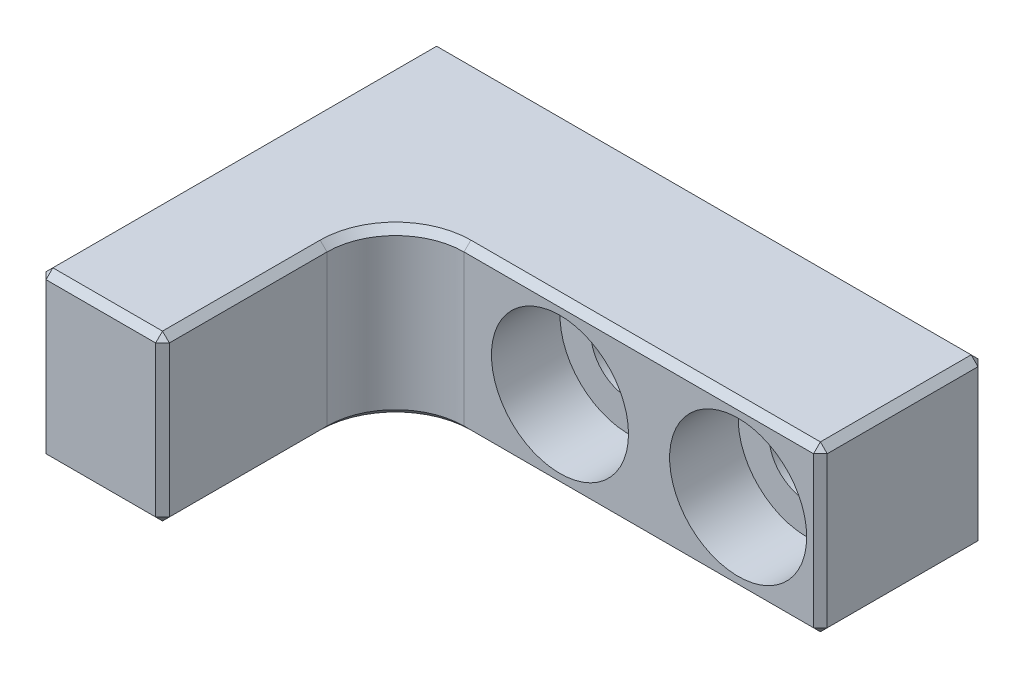
ISO-10303-21;
HEADER;
FILE_DESCRIPTION(('STEP AP214'),'2;1');
FILE_NAME('part.step','',(''),(''),'','','');
FILE_SCHEMA(('AUTOMOTIVE_DESIGN { 1 0 10303 214 1 1 1 1 }'));
ENDSEC;
DATA;
#1=APPLICATION_CONTEXT('core data for automotive mechanical design processes');
#2=APPLICATION_PROTOCOL_DEFINITION('international standard','automotive_design',2000,#1);
#3=PRODUCT_CONTEXT('',#1,'mechanical');
#4=PRODUCT('Part','Part','',(#3));
#5=PRODUCT_RELATED_PRODUCT_CATEGORY('part','',(#4));
#6=PRODUCT_DEFINITION_FORMATION('','',#4);
#7=PRODUCT_DEFINITION_CONTEXT('part definition',#1,'design');
#8=PRODUCT_DEFINITION('design','',#6,#7);
#9=PRODUCT_DEFINITION_SHAPE('','',#8);
#10=(LENGTH_UNIT() NAMED_UNIT(*) SI_UNIT(.MILLI.,.METRE.));
#11=(NAMED_UNIT(*) PLANE_ANGLE_UNIT() SI_UNIT($,.RADIAN.));
#12=(NAMED_UNIT(*) SI_UNIT($,.STERADIAN.) SOLID_ANGLE_UNIT());
#13=UNCERTAINTY_MEASURE_WITH_UNIT(LENGTH_MEASURE(1.E-05),#10,'distance_accuracy_value','');
#14=(GEOMETRIC_REPRESENTATION_CONTEXT(3) GLOBAL_UNCERTAINTY_ASSIGNED_CONTEXT((#13)) GLOBAL_UNIT_ASSIGNED_CONTEXT((#10,
#11,#12)) REPRESENTATION_CONTEXT('',''));
#15=CARTESIAN_POINT('',(0.,0.,0.));
#16=DIRECTION('',(0.,0.,1.));
#17=DIRECTION('',(1.,0.,0.));
#18=AXIS2_PLACEMENT_3D('',#15,#16,#17);
#19=CARTESIAN_POINT('',(0.,12.,12.));
#20=DIRECTION('',(0.,0.,-1.));
#21=DIRECTION('',(-1.,0.,0.));
#22=AXIS2_PLACEMENT_3D('',#19,#20,#21);
#23=PLANE('',#22);
#24=CARTESIAN_POINT('',(34.,6.,12.));
#25=DIRECTION('',(0.,0.,1.));
#26=DIRECTION('',(1.,0.,0.));
#27=AXIS2_PLACEMENT_3D('',#24,#25,#26);
#28=CIRCLE('',#27,5.);
#29=CARTESIAN_POINT('',(39.,6.,12.));
#30=VERTEX_POINT('',#29);
#31=EDGE_CURVE('E360',#30,#30,#28,.T.);
#32=ORIENTED_EDGE('',*,*,#31,.F.);
#33=EDGE_LOOP('',(#32));
#34=FACE_BOUND('',#33,.T.);
#35=CARTESIAN_POINT('',(21.,6.,12.));
#36=DIRECTION('',(0.,0.,1.));
#37=DIRECTION('',(1.,0.,0.));
#38=AXIS2_PLACEMENT_3D('',#35,#36,#37);
#39=CIRCLE('',#38,5.);
#40=CARTESIAN_POINT('',(26.,6.,12.));
#41=VERTEX_POINT('',#40);
#42=EDGE_CURVE('E379',#41,#41,#39,.T.);
#43=ORIENTED_EDGE('',*,*,#42,.F.);
#44=EDGE_LOOP('',(#43));
#45=FACE_BOUND('',#44,.T.);
#46=DIRECTION('',(0.,1.,0.));
#47=VECTOR('',#46,1.);
#48=CARTESIAN_POINT('',(39.5,12.,12.));
#49=LINE('',#48,#47);
#50=CARTESIAN_POINT('',(39.5,0.5,12.));
#51=VERTEX_POINT('',#50);
#52=CARTESIAN_POINT('',(39.5,11.5,12.));
#53=VERTEX_POINT('',#52);
#54=EDGE_CURVE('E226',#51,#53,#49,.T.);
#55=ORIENTED_EDGE('',*,*,#54,.T.);
#56=DIRECTION('',(-1.,0.,0.));
#57=VECTOR('',#56,1.);
#58=CARTESIAN_POINT('',(0.,11.5,12.));
#59=LINE('',#58,#57);
#60=CARTESIAN_POINT('',(14.,11.5,12.));
#61=VERTEX_POINT('',#60);
#62=EDGE_CURVE('E228',#53,#61,#59,.T.);
#63=ORIENTED_EDGE('',*,*,#62,.T.);
#64=DIRECTION('',(0.,1.,0.));
#65=VECTOR('',#64,1.);
#66=CARTESIAN_POINT('',(14.,0.,12.));
#67=LINE('',#66,#65);
#68=CARTESIAN_POINT('',(14.,0.5,12.));
#69=VERTEX_POINT('',#68);
#70=EDGE_CURVE('E201',#61,#69,#67,.F.);
#71=ORIENTED_EDGE('',*,*,#70,.T.);
#72=DIRECTION('',(1.,0.,0.));
#73=VECTOR('',#72,1.);
#74=CARTESIAN_POINT('',(0.,0.5,12.));
#75=LINE('',#74,#73);
#76=EDGE_CURVE('E224',#69,#51,#75,.T.);
#77=ORIENTED_EDGE('',*,*,#76,.T.);
#78=EDGE_LOOP('',(#55,#63,#71,#77));
#79=FACE_BOUND('',#78,.T.);
#80=ADVANCED_FACE('F34',(#34,#45,#79),#23,.F.);
#81=CARTESIAN_POINT('',(0.,0.,12.));
#82=DIRECTION('',(1.,0.,0.));
#83=DIRECTION('',(0.,0.,-1.));
#84=AXIS2_PLACEMENT_3D('',#81,#82,#83);
#85=PLANE('',#84);
#86=DIRECTION('',(0.,0.,1.));
#87=VECTOR('',#86,1.);
#88=CARTESIAN_POINT('',(0.,0.5,12.));
#89=LINE('',#88,#87);
#90=CARTESIAN_POINT('',(0.,0.5,0.5));
#91=VERTEX_POINT('',#90);
#92=CARTESIAN_POINT('',(0.,0.5,28.5));
#93=VERTEX_POINT('',#92);
#94=EDGE_CURVE('E219',#91,#93,#89,.T.);
#95=ORIENTED_EDGE('',*,*,#94,.T.);
#96=DIRECTION('',(0.,1.,0.));
#97=VECTOR('',#96,1.);
#98=CARTESIAN_POINT('',(0.,12.,28.5));
#99=LINE('',#98,#97);
#100=CARTESIAN_POINT('',(0.,11.5,28.5));
#101=VERTEX_POINT('',#100);
#102=EDGE_CURVE('E183',#93,#101,#99,.T.);
#103=ORIENTED_EDGE('',*,*,#102,.T.);
#104=DIRECTION('',(0.,0.,-1.));
#105=VECTOR('',#104,1.);
#106=CARTESIAN_POINT('',(0.,11.5,12.));
#107=LINE('',#106,#105);
#108=CARTESIAN_POINT('',(0.,11.5,0.5));
#109=VERTEX_POINT('',#108);
#110=EDGE_CURVE('E221',#101,#109,#107,.T.);
#111=ORIENTED_EDGE('',*,*,#110,.T.);
#112=DIRECTION('',(0.,-1.,0.));
#113=VECTOR('',#112,1.);
#114=CARTESIAN_POINT('',(0.,0.,0.5));
#115=LINE('',#114,#113);
#116=EDGE_CURVE('E217',#109,#91,#115,.T.);
#117=ORIENTED_EDGE('',*,*,#116,.T.);
#118=EDGE_LOOP('',(#95,#103,#111,#117));
#119=FACE_BOUND('',#118,.T.);
#120=ADVANCED_FACE('F429',(#119),#85,.F.);
#121=CARTESIAN_POINT('',(0.,0.,12.));
#122=DIRECTION('',(0.,1.,0.));
#123=DIRECTION('',(0.,0.,1.));
#124=AXIS2_PLACEMENT_3D('',#121,#122,#123);
#125=PLANE('',#124);
#126=DIRECTION('',(-1.,0.,0.));
#127=VECTOR('',#126,1.);
#128=CARTESIAN_POINT('',(0.,0.,28.5));
#129=LINE('',#128,#127);
#130=CARTESIAN_POINT('',(8.5,0.,28.5));
#131=VERTEX_POINT('',#130);
#132=CARTESIAN_POINT('',(0.5,0.,28.5));
#133=VERTEX_POINT('',#132);
#134=EDGE_CURVE('E43',#131,#133,#129,.T.);
#135=ORIENTED_EDGE('',*,*,#134,.T.);
#136=DIRECTION('',(0.,0.,-1.));
#137=VECTOR('',#136,1.);
#138=CARTESIAN_POINT('',(0.5,0.,12.));
#139=LINE('',#138,#137);
#140=CARTESIAN_POINT('',(0.5,0.,0.5));
#141=VERTEX_POINT('',#140);
#142=EDGE_CURVE('E11',#133,#141,#139,.T.);
#143=ORIENTED_EDGE('',*,*,#142,.T.);
#144=DIRECTION('',(1.,0.,0.));
#145=VECTOR('',#144,1.);
#146=CARTESIAN_POINT('',(40.,0.,0.5));
#147=LINE('',#146,#145);
#148=CARTESIAN_POINT('',(39.5,0.,0.5));
#149=VERTEX_POINT('',#148);
#150=EDGE_CURVE('E267',#141,#149,#147,.T.);
#151=ORIENTED_EDGE('',*,*,#150,.T.);
#152=DIRECTION('',(0.,0.,1.));
#153=VECTOR('',#152,1.);
#154=CARTESIAN_POINT('',(39.5,0.,12.));
#155=LINE('',#154,#153);
#156=CARTESIAN_POINT('',(39.5,0.,11.5));
#157=VERTEX_POINT('',#156);
#158=EDGE_CURVE('E269',#149,#157,#155,.T.);
#159=ORIENTED_EDGE('',*,*,#158,.T.);
#160=DIRECTION('',(-1.,0.,0.));
#161=VECTOR('',#160,1.);
#162=CARTESIAN_POINT('',(0.,0.,11.5));
#163=LINE('',#162,#161);
#164=CARTESIAN_POINT('',(14.,0.,11.5));
#165=VERTEX_POINT('',#164);
#166=EDGE_CURVE('E271',#157,#165,#163,.T.);
#167=ORIENTED_EDGE('',*,*,#166,.T.);
#168=CARTESIAN_POINT('',(14.,0.,17.));
#169=DIRECTION('',(0.,1.,0.));
#170=DIRECTION('',(0.,0.,1.));
#171=AXIS2_PLACEMENT_3D('',#168,#169,#170);
#172=CIRCLE('',#171,5.5);
#173=CARTESIAN_POINT('',(8.5,0.,17.));
#174=VERTEX_POINT('',#173);
#175=EDGE_CURVE('E273',#165,#174,#172,.T.);
#176=ORIENTED_EDGE('',*,*,#175,.T.);
#177=DIRECTION('',(0.,0.,1.));
#178=VECTOR('',#177,1.);
#179=CARTESIAN_POINT('',(8.5,0.,12.));
#180=LINE('',#179,#178);
#181=EDGE_CURVE('E54',#174,#131,#180,.T.);
#182=ORIENTED_EDGE('',*,*,#181,.T.);
#183=EDGE_LOOP('',(#135,#143,#151,#159,#167,#176,#182));
#184=FACE_BOUND('',#183,.T.);
#185=ADVANCED_FACE('F435',(#184),#125,.F.);
#186=CARTESIAN_POINT('',(40.,0.,12.));
#187=DIRECTION('',(-1.,0.,0.));
#188=DIRECTION('',(0.,0.,1.));
#189=AXIS2_PLACEMENT_3D('',#186,#187,#188);
#190=PLANE('',#189);
#191=DIRECTION('',(0.,1.,0.));
#192=VECTOR('',#191,1.);
#193=CARTESIAN_POINT('',(40.,12.,0.5));
#194=LINE('',#193,#192);
#195=CARTESIAN_POINT('',(40.,0.5,0.5));
#196=VERTEX_POINT('',#195);
#197=CARTESIAN_POINT('',(40.,11.5,0.5));
#198=VERTEX_POINT('',#197);
#199=EDGE_CURVE('E232',#196,#198,#194,.T.);
#200=ORIENTED_EDGE('',*,*,#199,.T.);
#201=DIRECTION('',(0.,0.,1.));
#202=VECTOR('',#201,1.);
#203=CARTESIAN_POINT('',(40.,11.5,12.));
#204=LINE('',#203,#202);
#205=CARTESIAN_POINT('',(40.,11.5,11.5));
#206=VERTEX_POINT('',#205);
#207=EDGE_CURVE('E237',#198,#206,#204,.T.);
#208=ORIENTED_EDGE('',*,*,#207,.T.);
#209=DIRECTION('',(0.,-1.,0.));
#210=VECTOR('',#209,1.);
#211=CARTESIAN_POINT('',(40.,0.,11.5));
#212=LINE('',#211,#210);
#213=CARTESIAN_POINT('',(40.,0.5,11.5));
#214=VERTEX_POINT('',#213);
#215=EDGE_CURVE('E234',#206,#214,#212,.T.);
#216=ORIENTED_EDGE('',*,*,#215,.T.);
#217=DIRECTION('',(0.,0.,-1.));
#218=VECTOR('',#217,1.);
#219=CARTESIAN_POINT('',(40.,0.5,12.));
#220=LINE('',#219,#218);
#221=EDGE_CURVE('E230',#214,#196,#220,.T.);
#222=ORIENTED_EDGE('',*,*,#221,.T.);
#223=EDGE_LOOP('',(#200,#208,#216,#222));
#224=FACE_BOUND('',#223,.T.);
#225=ADVANCED_FACE('F490',(#224),#190,.F.);
#226=CARTESIAN_POINT('',(0.,12.,12.));
#227=DIRECTION('',(0.,-1.,0.));
#228=DIRECTION('',(0.,0.,-1.));
#229=AXIS2_PLACEMENT_3D('',#226,#227,#228);
#230=PLANE('',#229);
#231=DIRECTION('',(1.,0.,0.));
#232=VECTOR('',#231,1.);
#233=CARTESIAN_POINT('',(0.,12.,11.5));
#234=LINE('',#233,#232);
#235=CARTESIAN_POINT('',(14.,12.,11.5));
#236=VERTEX_POINT('',#235);
#237=CARTESIAN_POINT('',(39.5,12.,11.5));
#238=VERTEX_POINT('',#237);
#239=EDGE_CURVE('E258',#236,#238,#234,.T.);
#240=ORIENTED_EDGE('',*,*,#239,.T.);
#241=DIRECTION('',(0.,0.,-1.));
#242=VECTOR('',#241,1.);
#243=CARTESIAN_POINT('',(39.5,12.,12.));
#244=LINE('',#243,#242);
#245=CARTESIAN_POINT('',(39.5,12.,0.5));
#246=VERTEX_POINT('',#245);
#247=EDGE_CURVE('E260',#238,#246,#244,.T.);
#248=ORIENTED_EDGE('',*,*,#247,.T.);
#249=DIRECTION('',(-1.,0.,0.));
#250=VECTOR('',#249,1.);
#251=CARTESIAN_POINT('',(0.,12.,0.5));
#252=LINE('',#251,#250);
#253=CARTESIAN_POINT('',(0.5,12.,0.5));
#254=VERTEX_POINT('',#253);
#255=EDGE_CURVE('E248',#246,#254,#252,.T.);
#256=ORIENTED_EDGE('',*,*,#255,.T.);
#257=DIRECTION('',(0.,0.,1.));
#258=VECTOR('',#257,1.);
#259=CARTESIAN_POINT('',(0.5,12.,12.));
#260=LINE('',#259,#258);
#261=CARTESIAN_POINT('',(0.5,12.,28.5));
#262=VERTEX_POINT('',#261);
#263=EDGE_CURVE('E250',#254,#262,#260,.T.);
#264=ORIENTED_EDGE('',*,*,#263,.T.);
#265=DIRECTION('',(1.,0.,0.));
#266=VECTOR('',#265,1.);
#267=CARTESIAN_POINT('',(9.,12.,28.5));
#268=LINE('',#267,#266);
#269=CARTESIAN_POINT('',(8.5,12.,28.5));
#270=VERTEX_POINT('',#269);
#271=EDGE_CURVE('E252',#262,#270,#268,.T.);
#272=ORIENTED_EDGE('',*,*,#271,.T.);
#273=DIRECTION('',(0.,0.,-1.));
#274=VECTOR('',#273,1.);
#275=CARTESIAN_POINT('',(8.5,12.,12.));
#276=LINE('',#275,#274);
#277=CARTESIAN_POINT('',(8.5,12.,17.));
#278=VERTEX_POINT('',#277);
#279=EDGE_CURVE('E254',#270,#278,#276,.T.);
#280=ORIENTED_EDGE('',*,*,#279,.T.);
#281=CARTESIAN_POINT('',(14.,12.,17.));
#282=DIRECTION('',(0.,-1.,0.));
#283=DIRECTION('',(0.,0.,-1.));
#284=AXIS2_PLACEMENT_3D('',#281,#282,#283);
#285=CIRCLE('',#284,5.5);
#286=EDGE_CURVE('E256',#278,#236,#285,.T.);
#287=ORIENTED_EDGE('',*,*,#286,.T.);
#288=EDGE_LOOP('',(#240,#248,#256,#264,#272,#280,#287));
#289=FACE_BOUND('',#288,.T.);
#290=ADVANCED_FACE('F486',(#289),#230,.F.);
#291=CARTESIAN_POINT('',(0.,12.,0.));
#292=DIRECTION('',(0.,0.,-1.));
#293=DIRECTION('',(-1.,0.,0.));
#294=AXIS2_PLACEMENT_3D('',#291,#292,#293);
#295=PLANE('',#294);
#296=DIRECTION('',(1.,0.,0.));
#297=VECTOR('',#296,1.);
#298=CARTESIAN_POINT('',(40.,11.5,0.));
#299=LINE('',#298,#297);
#300=CARTESIAN_POINT('',(0.5,11.5,0.));
#301=VERTEX_POINT('',#300);
#302=CARTESIAN_POINT('',(39.5,11.5,0.));
#303=VERTEX_POINT('',#302);
#304=EDGE_CURVE('E243',#301,#303,#299,.T.);
#305=ORIENTED_EDGE('',*,*,#304,.T.);
#306=DIRECTION('',(0.,-1.,0.));
#307=VECTOR('',#306,1.);
#308=CARTESIAN_POINT('',(39.5,0.,0.));
#309=LINE('',#308,#307);
#310=CARTESIAN_POINT('',(39.5,0.5,0.));
#311=VERTEX_POINT('',#310);
#312=EDGE_CURVE('E245',#303,#311,#309,.T.);
#313=ORIENTED_EDGE('',*,*,#312,.T.);
#314=DIRECTION('',(-1.,0.,0.));
#315=VECTOR('',#314,1.);
#316=CARTESIAN_POINT('',(0.,0.5,0.));
#317=LINE('',#316,#315);
#318=CARTESIAN_POINT('',(0.5,0.5,0.));
#319=VERTEX_POINT('',#318);
#320=EDGE_CURVE('E241',#311,#319,#317,.T.);
#321=ORIENTED_EDGE('',*,*,#320,.T.);
#322=DIRECTION('',(0.,1.,0.));
#323=VECTOR('',#322,1.);
#324=CARTESIAN_POINT('',(0.5,12.,0.));
#325=LINE('',#324,#323);
#326=EDGE_CURVE('E239',#319,#301,#325,.T.);
#327=ORIENTED_EDGE('',*,*,#326,.T.);
#328=EDGE_LOOP('',(#305,#313,#321,#327));
#329=FACE_BOUND('',#328,.T.);
#330=CARTESIAN_POINT('',(34.,6.,0.));
#331=DIRECTION('',(0.,0.,1.));
#332=DIRECTION('',(1.,0.,0.));
#333=AXIS2_PLACEMENT_3D('',#330,#331,#332);
#334=CIRCLE('',#333,2.75);
#335=CARTESIAN_POINT('',(36.75,6.,0.));
#336=VERTEX_POINT('',#335);
#337=EDGE_CURVE('E376',#336,#336,#334,.T.);
#338=ORIENTED_EDGE('',*,*,#337,.T.);
#339=EDGE_LOOP('',(#338));
#340=FACE_BOUND('',#339,.T.);
#341=CARTESIAN_POINT('',(21.,6.,0.));
#342=DIRECTION('',(0.,0.,1.));
#343=DIRECTION('',(1.,0.,0.));
#344=AXIS2_PLACEMENT_3D('',#341,#342,#343);
#345=CIRCLE('',#344,2.75);
#346=CARTESIAN_POINT('',(23.75,6.,0.));
#347=VERTEX_POINT('',#346);
#348=EDGE_CURVE('E388',#347,#347,#345,.T.);
#349=ORIENTED_EDGE('',*,*,#348,.T.);
#350=EDGE_LOOP('',(#349));
#351=FACE_BOUND('',#350,.T.);
#352=ADVANCED_FACE('F483',(#329,#340,#351),#295,.T.);
#353=CARTESIAN_POINT('',(9.,12.,29.));
#354=DIRECTION('',(-1.,0.,0.));
#355=DIRECTION('',(0.,-1.,0.));
#356=AXIS2_PLACEMENT_3D('',#353,#354,#355);
#357=PLANE('',#356);
#358=DIRECTION('',(0.,1.,0.));
#359=VECTOR('',#358,1.);
#360=CARTESIAN_POINT('',(9.,12.,17.));
#361=LINE('',#360,#359);
#362=CARTESIAN_POINT('',(9.,0.5,17.));
#363=VERTEX_POINT('',#362);
#364=CARTESIAN_POINT('',(9.,11.5,17.));
#365=VERTEX_POINT('',#364);
#366=EDGE_CURVE('E204',#363,#365,#361,.T.);
#367=ORIENTED_EDGE('',*,*,#366,.T.);
#368=DIRECTION('',(0.,0.,1.));
#369=VECTOR('',#368,1.);
#370=CARTESIAN_POINT('',(9.,11.5,29.));
#371=LINE('',#370,#369);
#372=CARTESIAN_POINT('',(9.,11.5,28.5));
#373=VERTEX_POINT('',#372);
#374=EDGE_CURVE('E215',#365,#373,#371,.T.);
#375=ORIENTED_EDGE('',*,*,#374,.T.);
#376=DIRECTION('',(0.,-1.,0.));
#377=VECTOR('',#376,1.);
#378=CARTESIAN_POINT('',(9.,0.,28.5));
#379=LINE('',#378,#377);
#380=CARTESIAN_POINT('',(9.,0.5,28.5));
#381=VERTEX_POINT('',#380);
#382=EDGE_CURVE('E212',#373,#381,#379,.T.);
#383=ORIENTED_EDGE('',*,*,#382,.T.);
#384=DIRECTION('',(0.,0.,-1.));
#385=VECTOR('',#384,1.);
#386=CARTESIAN_POINT('',(9.,0.5,29.));
#387=LINE('',#386,#385);
#388=EDGE_CURVE('E210',#381,#363,#387,.T.);
#389=ORIENTED_EDGE('',*,*,#388,.T.);
#390=EDGE_LOOP('',(#367,#375,#383,#389));
#391=FACE_BOUND('',#390,.T.);
#392=ADVANCED_FACE('F394',(#391),#357,.F.);
#393=CARTESIAN_POINT('',(0.,0.,29.));
#394=DIRECTION('',(0.,0.,1.));
#395=DIRECTION('',(1.,0.,0.));
#396=AXIS2_PLACEMENT_3D('',#393,#394,#395);
#397=PLANE('',#396);
#398=DIRECTION('',(0.,1.,0.));
#399=VECTOR('',#398,1.);
#400=CARTESIAN_POINT('',(8.5,12.,29.));
#401=LINE('',#400,#399);
#402=CARTESIAN_POINT('',(8.5,0.5,29.));
#403=VERTEX_POINT('',#402);
#404=CARTESIAN_POINT('',(8.5,11.5,29.));
#405=VERTEX_POINT('',#404);
#406=EDGE_CURVE('E175',#403,#405,#401,.T.);
#407=ORIENTED_EDGE('',*,*,#406,.T.);
#408=DIRECTION('',(-1.,0.,0.));
#409=VECTOR('',#408,1.);
#410=CARTESIAN_POINT('',(0.,11.5,29.));
#411=LINE('',#410,#409);
#412=CARTESIAN_POINT('',(0.5,11.5,29.));
#413=VERTEX_POINT('',#412);
#414=EDGE_CURVE('E171',#405,#413,#411,.T.);
#415=ORIENTED_EDGE('',*,*,#414,.T.);
#416=DIRECTION('',(0.,-1.,0.));
#417=VECTOR('',#416,1.);
#418=CARTESIAN_POINT('',(0.5,0.,29.));
#419=LINE('',#418,#417);
#420=CARTESIAN_POINT('',(0.5,0.5,29.));
#421=VERTEX_POINT('',#420);
#422=EDGE_CURVE('E163',#413,#421,#419,.T.);
#423=ORIENTED_EDGE('',*,*,#422,.T.);
#424=DIRECTION('',(1.,0.,0.));
#425=VECTOR('',#424,1.);
#426=CARTESIAN_POINT('',(9.,0.5,29.));
#427=LINE('',#426,#425);
#428=EDGE_CURVE('E168',#421,#403,#427,.T.);
#429=ORIENTED_EDGE('',*,*,#428,.T.);
#430=EDGE_LOOP('',(#407,#415,#423,#429));
#431=FACE_BOUND('',#430,.T.);
#432=ADVANCED_FACE('F166',(#431),#397,.T.);
#433=CARTESIAN_POINT('',(14.,12.,17.));
#434=DIRECTION('',(0.,-1.,0.));
#435=DIRECTION('',(1.,0.,0.));
#436=AXIS2_PLACEMENT_3D('',#433,#434,#435);
#437=CYLINDRICAL_SURFACE('',#436,5.);
#438=ORIENTED_EDGE('',*,*,#70,.F.);
#439=CARTESIAN_POINT('',(14.,11.5,17.));
#440=DIRECTION('',(0.,-1.,0.));
#441=DIRECTION('',(0.,0.,-1.));
#442=AXIS2_PLACEMENT_3D('',#439,#440,#441);
#443=CIRCLE('',#442,5.);
#444=EDGE_CURVE('E265',#61,#365,#443,.F.);
#445=ORIENTED_EDGE('',*,*,#444,.T.);
#446=ORIENTED_EDGE('',*,*,#366,.F.);
#447=CARTESIAN_POINT('',(14.,0.5,17.));
#448=DIRECTION('',(0.,1.,0.));
#449=DIRECTION('',(0.,0.,1.));
#450=AXIS2_PLACEMENT_3D('',#447,#448,#449);
#451=CIRCLE('',#450,5.);
#452=EDGE_CURVE('E263',#363,#69,#451,.F.);
#453=ORIENTED_EDGE('',*,*,#452,.T.);
#454=EDGE_LOOP('',(#438,#445,#446,#453));
#455=FACE_BOUND('',#454,.T.);
#456=ADVANCED_FACE('F497',(#455),#437,.F.);
#457=CARTESIAN_POINT('',(21.,6.,12.));
#458=DIRECTION('',(0.,0.,1.));
#459=DIRECTION('',(1.,0.,0.));
#460=AXIS2_PLACEMENT_3D('',#457,#458,#459);
#461=CYLINDRICAL_SURFACE('',#460,2.75);
#462=ORIENTED_EDGE('',*,*,#348,.F.);
#463=EDGE_LOOP('',(#462));
#464=FACE_BOUND('',#463,.T.);
#465=CARTESIAN_POINT('',(21.,6.,7.));
#466=DIRECTION('',(0.,0.,1.));
#467=DIRECTION('',(1.,0.,0.));
#468=AXIS2_PLACEMENT_3D('',#465,#466,#467);
#469=CIRCLE('',#468,2.75);
#470=CARTESIAN_POINT('',(23.75,6.,7.));
#471=VERTEX_POINT('',#470);
#472=EDGE_CURVE('E385',#471,#471,#469,.T.);
#473=ORIENTED_EDGE('',*,*,#472,.T.);
#474=EDGE_LOOP('',(#473));
#475=FACE_BOUND('',#474,.T.);
#476=ADVANCED_FACE('F500',(#464,#475),#461,.F.);
#477=CARTESIAN_POINT('',(23.75,6.,7.));
#478=DIRECTION('',(0.,0.,-1.));
#479=DIRECTION('',(-1.,0.,0.));
#480=AXIS2_PLACEMENT_3D('',#477,#478,#479);
#481=PLANE('',#480);
#482=ORIENTED_EDGE('',*,*,#472,.F.);
#483=EDGE_LOOP('',(#482));
#484=FACE_BOUND('',#483,.T.);
#485=CARTESIAN_POINT('',(21.,6.,7.));
#486=DIRECTION('',(0.,0.,1.));
#487=DIRECTION('',(1.,0.,0.));
#488=AXIS2_PLACEMENT_3D('',#485,#486,#487);
#489=CIRCLE('',#488,5.);
#490=CARTESIAN_POINT('',(26.,6.,7.));
#491=VERTEX_POINT('',#490);
#492=EDGE_CURVE('E382',#491,#491,#489,.T.);
#493=ORIENTED_EDGE('',*,*,#492,.T.);
#494=EDGE_LOOP('',(#493));
#495=FACE_BOUND('',#494,.T.);
#496=ADVANCED_FACE('F776',(#484,#495),#481,.F.);
#497=CARTESIAN_POINT('',(21.,6.,12.));
#498=DIRECTION('',(0.,0.,1.));
#499=DIRECTION('',(1.,0.,0.));
#500=AXIS2_PLACEMENT_3D('',#497,#498,#499);
#501=CYLINDRICAL_SURFACE('',#500,5.);
#502=ORIENTED_EDGE('',*,*,#492,.F.);
#503=EDGE_LOOP('',(#502));
#504=FACE_BOUND('',#503,.T.);
#505=ORIENTED_EDGE('',*,*,#42,.T.);
#506=EDGE_LOOP('',(#505));
#507=FACE_BOUND('',#506,.T.);
#508=ADVANCED_FACE('F766',(#504,#507),#501,.F.);
#509=CARTESIAN_POINT('',(34.,6.,12.));
#510=DIRECTION('',(0.,0.,1.));
#511=DIRECTION('',(1.,0.,0.));
#512=AXIS2_PLACEMENT_3D('',#509,#510,#511);
#513=CYLINDRICAL_SURFACE('',#512,2.75);
#514=ORIENTED_EDGE('',*,*,#337,.F.);
#515=EDGE_LOOP('',(#514));
#516=FACE_BOUND('',#515,.T.);
#517=CARTESIAN_POINT('',(34.,6.,7.));
#518=DIRECTION('',(0.,0.,1.));
#519=DIRECTION('',(1.,0.,0.));
#520=AXIS2_PLACEMENT_3D('',#517,#518,#519);
#521=CIRCLE('',#520,2.75);
#522=CARTESIAN_POINT('',(36.75,6.,7.));
#523=VERTEX_POINT('',#522);
#524=EDGE_CURVE('E371',#523,#523,#521,.T.);
#525=ORIENTED_EDGE('',*,*,#524,.T.);
#526=EDGE_LOOP('',(#525));
#527=FACE_BOUND('',#526,.T.);
#528=ADVANCED_FACE('F756',(#516,#527),#513,.F.);
#529=CARTESIAN_POINT('',(36.75,6.,7.));
#530=DIRECTION('',(0.,0.,-1.));
#531=DIRECTION('',(-1.,0.,0.));
#532=AXIS2_PLACEMENT_3D('',#529,#530,#531);
#533=PLANE('',#532);
#534=ORIENTED_EDGE('',*,*,#524,.F.);
#535=EDGE_LOOP('',(#534));
#536=FACE_BOUND('',#535,.T.);
#537=CARTESIAN_POINT('',(34.,6.,7.));
#538=DIRECTION('',(0.,0.,1.));
#539=DIRECTION('',(1.,0.,0.));
#540=AXIS2_PLACEMENT_3D('',#537,#538,#539);
#541=CIRCLE('',#540,5.);
#542=CARTESIAN_POINT('',(39.,6.,7.));
#543=VERTEX_POINT('',#542);
#544=EDGE_CURVE('E366',#543,#543,#541,.T.);
#545=ORIENTED_EDGE('',*,*,#544,.T.);
#546=EDGE_LOOP('',(#545));
#547=FACE_BOUND('',#546,.T.);
#548=ADVANCED_FACE('F745',(#536,#547),#533,.F.);
#549=CARTESIAN_POINT('',(34.,6.,12.));
#550=DIRECTION('',(0.,0.,1.));
#551=DIRECTION('',(1.,0.,0.));
#552=AXIS2_PLACEMENT_3D('',#549,#550,#551);
#553=CYLINDRICAL_SURFACE('',#552,5.);
#554=ORIENTED_EDGE('',*,*,#544,.F.);
#555=EDGE_LOOP('',(#554));
#556=FACE_BOUND('',#555,.T.);
#557=ORIENTED_EDGE('',*,*,#31,.T.);
#558=EDGE_LOOP('',(#557));
#559=FACE_BOUND('',#558,.T.);
#560=ADVANCED_FACE('F735',(#556,#559),#553,.F.);
#561=CARTESIAN_POINT('',(40.,0.,0.5));
#562=DIRECTION('',(0.707106781186547,0.,-0.707106781186547));
#563=DIRECTION('',(-0.707106781186548,0.,-0.707106781186548));
#564=AXIS2_PLACEMENT_3D('',#561,#562,#563);
#565=PLANE('',#564);
#566=DIRECTION('',(0.707106781186547,0.,0.707106781186547));
#567=VECTOR('',#566,1.);
#568=CARTESIAN_POINT('',(39.5,0.5,0.));
#569=LINE('',#568,#567);
#570=EDGE_CURVE('E38',#311,#196,#569,.T.);
#571=ORIENTED_EDGE('',*,*,#570,.F.);
#572=ORIENTED_EDGE('',*,*,#312,.F.);
#573=DIRECTION('',(-0.707106781186547,0.,-0.707106781186547));
#574=VECTOR('',#573,1.);
#575=CARTESIAN_POINT('',(40.,11.5,0.5));
#576=LINE('',#575,#574);
#577=EDGE_CURVE('E353',#198,#303,#576,.T.);
#578=ORIENTED_EDGE('',*,*,#577,.F.);
#579=ORIENTED_EDGE('',*,*,#199,.F.);
#580=EDGE_LOOP('',(#571,#572,#578,#579));
#581=FACE_BOUND('',#580,.T.);
#582=ADVANCED_FACE('F36',(#581),#565,.T.);
#583=CARTESIAN_POINT('',(39.5,0.5,0.));
#584=DIRECTION('',(0.577350269189626,-0.577350269189626,-0.577350269189626));
#585=DIRECTION('',(-0.707106781186547,0.,-0.707106781186547));
#586=AXIS2_PLACEMENT_3D('',#583,#584,#585);
#587=PLANE('',#586);
#588=DIRECTION('',(0.,0.707106781186547,-0.707106781186547));
#589=VECTOR('',#588,1.);
#590=CARTESIAN_POINT('',(39.5,0.5,0.));
#591=LINE('',#590,#589);
#592=EDGE_CURVE('E348',#311,#149,#591,.F.);
#593=ORIENTED_EDGE('',*,*,#592,.F.);
#594=ORIENTED_EDGE('',*,*,#570,.T.);
#595=DIRECTION('',(0.707106781186547,0.707106781186547,0.));
#596=VECTOR('',#595,1.);
#597=CARTESIAN_POINT('',(39.75,0.25,0.5));
#598=LINE('',#597,#596);
#599=EDGE_CURVE('E351',#149,#196,#598,.T.);
#600=ORIENTED_EDGE('',*,*,#599,.F.);
#601=EDGE_LOOP('',(#593,#594,#600));
#602=FACE_BOUND('',#601,.T.);
#603=ADVANCED_FACE('F442',(#602),#587,.T.);
#604=CARTESIAN_POINT('',(40.,11.5,0.5));
#605=DIRECTION('',(0.577350269189626,0.577350269189626,-0.577350269189626));
#606=DIRECTION('',(-0.707106781186547,0.,-0.707106781186547));
#607=AXIS2_PLACEMENT_3D('',#604,#605,#606);
#608=PLANE('',#607);
#609=DIRECTION('',(-0.707106781186547,0.707106781186547,0.));
#610=VECTOR('',#609,1.);
#611=CARTESIAN_POINT('',(40.,11.5,0.5));
#612=LINE('',#611,#610);
#613=EDGE_CURVE('E342',#198,#246,#612,.T.);
#614=ORIENTED_EDGE('',*,*,#613,.F.);
#615=ORIENTED_EDGE('',*,*,#577,.T.);
#616=DIRECTION('',(0.,0.707106781186547,0.707106781186547));
#617=VECTOR('',#616,1.);
#618=CARTESIAN_POINT('',(39.5,11.75,0.25));
#619=LINE('',#618,#617);
#620=EDGE_CURVE('E345',#246,#303,#619,.F.);
#621=ORIENTED_EDGE('',*,*,#620,.F.);
#622=EDGE_LOOP('',(#614,#615,#621));
#623=FACE_BOUND('',#622,.T.);
#624=ADVANCED_FACE('F711',(#623),#608,.T.);
#625=CARTESIAN_POINT('',(40.,0.5,12.));
#626=DIRECTION('',(-0.707106781186547,0.707106781186547,0.));
#627=DIRECTION('',(-0.707106781186548,-0.707106781186548,0.));
#628=AXIS2_PLACEMENT_3D('',#625,#626,#627);
#629=PLANE('',#628);
#630=ORIENTED_EDGE('',*,*,#599,.T.);
#631=ORIENTED_EDGE('',*,*,#221,.F.);
#632=DIRECTION('',(-0.707106781186547,-0.707106781186547,0.));
#633=VECTOR('',#632,1.);
#634=CARTESIAN_POINT('',(40.,0.5,11.5));
#635=LINE('',#634,#633);
#636=EDGE_CURVE('E337',#157,#214,#635,.F.);
#637=ORIENTED_EDGE('',*,*,#636,.F.);
#638=ORIENTED_EDGE('',*,*,#158,.F.);
#639=EDGE_LOOP('',(#630,#631,#637,#638));
#640=FACE_BOUND('',#639,.T.);
#641=ADVANCED_FACE('F445',(#640),#629,.F.);
#642=CARTESIAN_POINT('',(0.,0.,0.5));
#643=DIRECTION('',(0.,-0.707106781186547,-0.707106781186547));
#644=DIRECTION('',(0.,0.707106781186548,-0.707106781186548));
#645=AXIS2_PLACEMENT_3D('',#642,#643,#644);
#646=PLANE('',#645);
#647=ORIENTED_EDGE('',*,*,#592,.T.);
#648=ORIENTED_EDGE('',*,*,#150,.F.);
#649=DIRECTION('',(0.,-0.707106781186547,0.707106781186547));
#650=VECTOR('',#649,1.);
#651=CARTESIAN_POINT('',(0.5,0.,0.5));
#652=LINE('',#651,#650);
#653=EDGE_CURVE('E334',#319,#141,#652,.T.);
#654=ORIENTED_EDGE('',*,*,#653,.F.);
#655=ORIENTED_EDGE('',*,*,#320,.F.);
#656=EDGE_LOOP('',(#647,#648,#654,#655));
#657=FACE_BOUND('',#656,.T.);
#658=ADVANCED_FACE('F441',(#657),#646,.T.);
#659=CARTESIAN_POINT('',(0.,0.,0.5));
#660=DIRECTION('',(-0.707106781186547,0.,-0.707106781186547));
#661=DIRECTION('',(-0.707106781186548,0.,0.707106781186548));
#662=AXIS2_PLACEMENT_3D('',#659,#660,#661);
#663=PLANE('',#662);
#664=DIRECTION('',(-0.707106781186547,0.,0.707106781186547));
#665=VECTOR('',#664,1.);
#666=CARTESIAN_POINT('',(0.,11.5,0.5));
#667=LINE('',#666,#665);
#668=EDGE_CURVE('E328',#301,#109,#667,.T.);
#669=ORIENTED_EDGE('',*,*,#668,.F.);
#670=ORIENTED_EDGE('',*,*,#326,.F.);
#671=DIRECTION('',(0.707106781186547,0.,-0.707106781186547));
#672=VECTOR('',#671,1.);
#673=CARTESIAN_POINT('',(0.25,0.5,0.25));
#674=LINE('',#673,#672);
#675=EDGE_CURVE('E331',#91,#319,#674,.T.);
#676=ORIENTED_EDGE('',*,*,#675,.F.);
#677=ORIENTED_EDGE('',*,*,#116,.F.);
#678=EDGE_LOOP('',(#669,#670,#676,#677));
#679=FACE_BOUND('',#678,.T.);
#680=ADVANCED_FACE('F684',(#679),#663,.T.);
#681=CARTESIAN_POINT('',(0.,12.,0.5));
#682=DIRECTION('',(0.,0.707106781186547,-0.707106781186547));
#683=DIRECTION('',(0.,0.707106781186548,0.707106781186548));
#684=AXIS2_PLACEMENT_3D('',#681,#682,#683);
#685=PLANE('',#684);
#686=ORIENTED_EDGE('',*,*,#620,.T.);
#687=ORIENTED_EDGE('',*,*,#304,.F.);
#688=DIRECTION('',(0.,-0.707106781186547,-0.707106781186547));
#689=VECTOR('',#688,1.);
#690=CARTESIAN_POINT('',(0.5,11.75,0.25));
#691=LINE('',#690,#689);
#692=EDGE_CURVE('E325',#254,#301,#691,.T.);
#693=ORIENTED_EDGE('',*,*,#692,.F.);
#694=ORIENTED_EDGE('',*,*,#255,.F.);
#695=EDGE_LOOP('',(#686,#687,#693,#694));
#696=FACE_BOUND('',#695,.T.);
#697=ADVANCED_FACE('F674',(#696),#685,.T.);
#698=CARTESIAN_POINT('',(39.5,12.,12.));
#699=DIRECTION('',(-0.707106781186547,-0.707106781186547,0.));
#700=DIRECTION('',(0.707106781186548,-0.707106781186548,0.));
#701=AXIS2_PLACEMENT_3D('',#698,#699,#700);
#702=PLANE('',#701);
#703=ORIENTED_EDGE('',*,*,#613,.T.);
#704=ORIENTED_EDGE('',*,*,#247,.F.);
#705=DIRECTION('',(0.707106781186547,-0.707106781186547,0.));
#706=VECTOR('',#705,1.);
#707=CARTESIAN_POINT('',(39.75,11.75,11.5));
#708=LINE('',#707,#706);
#709=EDGE_CURVE('E322',#206,#238,#708,.F.);
#710=ORIENTED_EDGE('',*,*,#709,.F.);
#711=ORIENTED_EDGE('',*,*,#207,.F.);
#712=EDGE_LOOP('',(#703,#704,#710,#711));
#713=FACE_BOUND('',#712,.T.);
#714=ADVANCED_FACE('F664',(#713),#702,.F.);
#715=CARTESIAN_POINT('',(39.5,12.,12.));
#716=DIRECTION('',(-0.707106781186547,0.,-0.707106781186547));
#717=DIRECTION('',(-0.707106781186548,0.,0.707106781186548));
#718=AXIS2_PLACEMENT_3D('',#715,#716,#717);
#719=PLANE('',#718);
#720=DIRECTION('',(0.707106781186547,0.,-0.707106781186547));
#721=VECTOR('',#720,1.);
#722=CARTESIAN_POINT('',(40.,0.5,11.5));
#723=LINE('',#722,#721);
#724=EDGE_CURVE('E339',#214,#51,#723,.F.);
#725=ORIENTED_EDGE('',*,*,#724,.F.);
#726=ORIENTED_EDGE('',*,*,#215,.F.);
#727=DIRECTION('',(-0.707106781186547,0.,0.707106781186547));
#728=VECTOR('',#727,1.);
#729=CARTESIAN_POINT('',(39.5,11.5,12.));
#730=LINE('',#729,#728);
#731=EDGE_CURVE('E319',#53,#206,#730,.F.);
#732=ORIENTED_EDGE('',*,*,#731,.F.);
#733=ORIENTED_EDGE('',*,*,#54,.F.);
#734=EDGE_LOOP('',(#725,#726,#732,#733));
#735=FACE_BOUND('',#734,.T.);
#736=ADVANCED_FACE('F655',(#735),#719,.F.);
#737=CARTESIAN_POINT('',(40.,0.5,11.5));
#738=DIRECTION('',(0.577350269189626,-0.577350269189626,0.577350269189626));
#739=DIRECTION('',(0.707106781186547,0.,-0.707106781186547));
#740=AXIS2_PLACEMENT_3D('',#737,#738,#739);
#741=PLANE('',#740);
#742=ORIENTED_EDGE('',*,*,#636,.T.);
#743=ORIENTED_EDGE('',*,*,#724,.T.);
#744=DIRECTION('',(0.,0.707106781186547,0.707106781186547));
#745=VECTOR('',#744,1.);
#746=CARTESIAN_POINT('',(39.5,0.25,11.75));
#747=LINE('',#746,#745);
#748=EDGE_CURVE('E316',#157,#51,#747,.T.);
#749=ORIENTED_EDGE('',*,*,#748,.F.);
#750=EDGE_LOOP('',(#742,#743,#749));
#751=FACE_BOUND('',#750,.T.);
#752=ADVANCED_FACE('F450',(#751),#741,.T.);
#753=CARTESIAN_POINT('',(0.5,0.,0.5));
#754=DIRECTION('',(-0.577350269189626,-0.577350269189626,-0.577350269189626));
#755=DIRECTION('',(-0.707106781186547,0.,0.707106781186547));
#756=AXIS2_PLACEMENT_3D('',#753,#754,#755);
#757=PLANE('',#756);
#758=ORIENTED_EDGE('',*,*,#675,.T.);
#759=ORIENTED_EDGE('',*,*,#653,.T.);
#760=DIRECTION('',(0.707106781186547,-0.707106781186547,0.));
#761=VECTOR('',#760,1.);
#762=CARTESIAN_POINT('',(0.5,0.,0.5));
#763=LINE('',#762,#761);
#764=EDGE_CURVE('E314',#91,#141,#763,.T.);
#765=ORIENTED_EDGE('',*,*,#764,.F.);
#766=EDGE_LOOP('',(#758,#759,#765));
#767=FACE_BOUND('',#766,.T.);
#768=ADVANCED_FACE('F636',(#767),#757,.T.);
#769=CARTESIAN_POINT('',(0.,11.5,0.5));
#770=DIRECTION('',(-0.577350269189626,0.577350269189626,-0.577350269189626));
#771=DIRECTION('',(-0.707106781186547,0.,0.707106781186547));
#772=AXIS2_PLACEMENT_3D('',#769,#770,#771);
#773=PLANE('',#772);
#774=ORIENTED_EDGE('',*,*,#692,.T.);
#775=ORIENTED_EDGE('',*,*,#668,.T.);
#776=DIRECTION('',(-0.707106781186547,-0.707106781186547,0.));
#777=VECTOR('',#776,1.);
#778=CARTESIAN_POINT('',(0.,11.5,0.5));
#779=LINE('',#778,#777);
#780=EDGE_CURVE('E311',#254,#109,#779,.T.);
#781=ORIENTED_EDGE('',*,*,#780,.F.);
#782=EDGE_LOOP('',(#774,#775,#781));
#783=FACE_BOUND('',#782,.T.);
#784=ADVANCED_FACE('F626',(#783),#773,.T.);
#785=CARTESIAN_POINT('',(39.5,11.5,12.));
#786=DIRECTION('',(0.577350269189626,0.577350269189626,0.577350269189626));
#787=DIRECTION('',(0.707106781186547,0.,-0.707106781186547));
#788=AXIS2_PLACEMENT_3D('',#785,#786,#787);
#789=PLANE('',#788);
#790=ORIENTED_EDGE('',*,*,#731,.T.);
#791=ORIENTED_EDGE('',*,*,#709,.T.);
#792=DIRECTION('',(0.,0.707106781186547,-0.707106781186547));
#793=VECTOR('',#792,1.);
#794=CARTESIAN_POINT('',(39.5,11.5,12.));
#795=LINE('',#794,#793);
#796=EDGE_CURVE('E308',#53,#238,#795,.T.);
#797=ORIENTED_EDGE('',*,*,#796,.F.);
#798=EDGE_LOOP('',(#790,#791,#797));
#799=FACE_BOUND('',#798,.T.);
#800=ADVANCED_FACE('F617',(#799),#789,.T.);
#801=CARTESIAN_POINT('',(0.,0.5,12.));
#802=DIRECTION('',(0.,0.707106781186547,-0.707106781186547));
#803=DIRECTION('',(0.,0.707106781186548,0.707106781186548));
#804=AXIS2_PLACEMENT_3D('',#801,#802,#803);
#805=PLANE('',#804);
#806=ORIENTED_EDGE('',*,*,#748,.T.);
#807=ORIENTED_EDGE('',*,*,#76,.F.);
#808=DIRECTION('',(0.,0.707106781186547,0.707106781186547));
#809=VECTOR('',#808,1.);
#810=CARTESIAN_POINT('',(14.,0.,11.5));
#811=LINE('',#810,#809);
#812=EDGE_CURVE('E305',#165,#69,#811,.T.);
#813=ORIENTED_EDGE('',*,*,#812,.F.);
#814=ORIENTED_EDGE('',*,*,#166,.F.);
#815=EDGE_LOOP('',(#806,#807,#813,#814));
#816=FACE_BOUND('',#815,.T.);
#817=ADVANCED_FACE('F454',(#816),#805,.F.);
#818=CARTESIAN_POINT('',(0.5,0.,12.));
#819=DIRECTION('',(0.707106781186547,0.707106781186547,0.));
#820=DIRECTION('',(-0.707106781186548,0.707106781186548,0.));
#821=AXIS2_PLACEMENT_3D('',#818,#819,#820);
#822=PLANE('',#821);
#823=ORIENTED_EDGE('',*,*,#764,.T.);
#824=ORIENTED_EDGE('',*,*,#142,.F.);
#825=DIRECTION('',(-0.707106781186547,0.707106781186547,0.));
#826=VECTOR('',#825,1.);
#827=CARTESIAN_POINT('',(0.25,0.25,28.5));
#828=LINE('',#827,#826);
#829=EDGE_CURVE('E187',#93,#133,#828,.F.);
#830=ORIENTED_EDGE('',*,*,#829,.F.);
#831=ORIENTED_EDGE('',*,*,#94,.F.);
#832=EDGE_LOOP('',(#823,#824,#830,#831));
#833=FACE_BOUND('',#832,.T.);
#834=ADVANCED_FACE('F433',(#833),#822,.F.);
#835=CARTESIAN_POINT('',(0.5,0.,29.));
#836=DIRECTION('',(-0.707106781186547,0.,0.707106781186547));
#837=DIRECTION('',(0.707106781186548,0.,0.707106781186548));
#838=AXIS2_PLACEMENT_3D('',#835,#836,#837);
#839=PLANE('',#838);
#840=DIRECTION('',(0.707106781186547,0.,0.707106781186547));
#841=VECTOR('',#840,1.);
#842=CARTESIAN_POINT('',(0.,11.5,28.5));
#843=LINE('',#842,#841);
#844=EDGE_CURVE('E188',#101,#413,#843,.T.);
#845=ORIENTED_EDGE('',*,*,#844,.F.);
#846=ORIENTED_EDGE('',*,*,#102,.F.);
#847=DIRECTION('',(-0.707106781186547,0.,-0.707106781186547));
#848=VECTOR('',#847,1.);
#849=CARTESIAN_POINT('',(0.5,0.5,29.));
#850=LINE('',#849,#848);
#851=EDGE_CURVE('E179',#421,#93,#850,.T.);
#852=ORIENTED_EDGE('',*,*,#851,.F.);
#853=ORIENTED_EDGE('',*,*,#422,.F.);
#854=EDGE_LOOP('',(#845,#846,#852,#853));
#855=FACE_BOUND('',#854,.T.);
#856=ADVANCED_FACE('F181',(#855),#839,.T.);
#857=CARTESIAN_POINT('',(0.,11.5,12.));
#858=DIRECTION('',(0.707106781186547,-0.707106781186547,0.));
#859=DIRECTION('',(0.707106781186548,0.707106781186548,0.));
#860=AXIS2_PLACEMENT_3D('',#857,#858,#859);
#861=PLANE('',#860);
#862=ORIENTED_EDGE('',*,*,#780,.T.);
#863=ORIENTED_EDGE('',*,*,#110,.F.);
#864=DIRECTION('',(0.707106781186547,0.707106781186547,0.));
#865=VECTOR('',#864,1.);
#866=CARTESIAN_POINT('',(0.,11.5,28.5));
#867=LINE('',#866,#865);
#868=EDGE_CURVE('E301',#262,#101,#867,.F.);
#869=ORIENTED_EDGE('',*,*,#868,.F.);
#870=ORIENTED_EDGE('',*,*,#263,.F.);
#871=EDGE_LOOP('',(#862,#863,#869,#870));
#872=FACE_BOUND('',#871,.T.);
#873=ADVANCED_FACE('F424',(#872),#861,.F.);
#874=CARTESIAN_POINT('',(0.,11.5,12.));
#875=DIRECTION('',(0.,-0.707106781186547,-0.707106781186547));
#876=DIRECTION('',(0.,0.707106781186548,-0.707106781186548));
#877=AXIS2_PLACEMENT_3D('',#874,#875,#876);
#878=PLANE('',#877);
#879=ORIENTED_EDGE('',*,*,#796,.T.);
#880=ORIENTED_EDGE('',*,*,#239,.F.);
#881=DIRECTION('',(0.,0.707106781186547,-0.707106781186547));
#882=VECTOR('',#881,1.);
#883=CARTESIAN_POINT('',(14.,11.5,12.));
#884=LINE('',#883,#882);
#885=EDGE_CURVE('E298',#61,#236,#884,.T.);
#886=ORIENTED_EDGE('',*,*,#885,.F.);
#887=ORIENTED_EDGE('',*,*,#62,.F.);
#888=EDGE_LOOP('',(#879,#880,#886,#887));
#889=FACE_BOUND('',#888,.T.);
#890=ADVANCED_FACE('F575',(#889),#878,.F.);
#891=CARTESIAN_POINT('',(14.,0.,17.));
#892=DIRECTION('',(0.,-1.,0.));
#893=DIRECTION('',(0.,0.,-1.));
#894=AXIS2_PLACEMENT_3D('',#891,#892,#893);
#895=CONICAL_SURFACE('',#894,5.5,0.785398163397449);
#896=ORIENTED_EDGE('',*,*,#812,.T.);
#897=ORIENTED_EDGE('',*,*,#452,.F.);
#898=DIRECTION('',(0.707106781186549,0.707106781186546,0.));
#899=VECTOR('',#898,1.);
#900=CARTESIAN_POINT('',(8.5,0.,17.));
#901=LINE('',#900,#899);
#902=EDGE_CURVE('E194',#174,#363,#901,.T.);
#903=ORIENTED_EDGE('',*,*,#902,.F.);
#904=ORIENTED_EDGE('',*,*,#175,.F.);
#905=EDGE_LOOP('',(#896,#897,#903,#904));
#906=FACE_BOUND('',#905,.T.);
#907=ADVANCED_FACE('F458',(#906),#895,.F.);
#908=CARTESIAN_POINT('',(0.5,0.5,29.));
#909=DIRECTION('',(-0.577350269189626,-0.577350269189626,0.577350269189626));
#910=DIRECTION('',(0.707106781186547,0.,0.707106781186547));
#911=AXIS2_PLACEMENT_3D('',#908,#909,#910);
#912=PLANE('',#911);
#913=ORIENTED_EDGE('',*,*,#851,.T.);
#914=ORIENTED_EDGE('',*,*,#829,.T.);
#915=DIRECTION('',(0.,0.707106781186547,0.707106781186547));
#916=VECTOR('',#915,1.);
#917=CARTESIAN_POINT('',(0.5,0.5,29.));
#918=LINE('',#917,#916);
#919=EDGE_CURVE('E191',#421,#133,#918,.F.);
#920=ORIENTED_EDGE('',*,*,#919,.F.);
#921=EDGE_LOOP('',(#913,#914,#920));
#922=FACE_BOUND('',#921,.T.);
#923=ADVANCED_FACE('F192',(#922),#912,.T.);
#924=CARTESIAN_POINT('',(0.,11.5,28.5));
#925=DIRECTION('',(-0.577350269189626,0.577350269189626,0.577350269189626));
#926=DIRECTION('',(0.707106781186547,0.,0.707106781186547));
#927=AXIS2_PLACEMENT_3D('',#924,#925,#926);
#928=PLANE('',#927);
#929=ORIENTED_EDGE('',*,*,#868,.T.);
#930=ORIENTED_EDGE('',*,*,#844,.T.);
#931=DIRECTION('',(0.,0.707106781186547,-0.707106781186547));
#932=VECTOR('',#931,1.);
#933=CARTESIAN_POINT('',(0.5,11.75,28.75));
#934=LINE('',#933,#932);
#935=EDGE_CURVE('E195',#262,#413,#934,.F.);
#936=ORIENTED_EDGE('',*,*,#935,.F.);
#937=EDGE_LOOP('',(#929,#930,#936));
#938=FACE_BOUND('',#937,.T.);
#939=ADVANCED_FACE('F420',(#938),#928,.T.);
#940=CARTESIAN_POINT('',(14.,12.,17.));
#941=DIRECTION('',(0.,1.,0.));
#942=DIRECTION('',(0.,0.,1.));
#943=AXIS2_PLACEMENT_3D('',#940,#941,#942);
#944=CONICAL_SURFACE('',#943,5.5,0.785398163397447);
#945=ORIENTED_EDGE('',*,*,#885,.T.);
#946=ORIENTED_EDGE('',*,*,#286,.F.);
#947=DIRECTION('',(-0.707106781186547,0.707106781186547,0.));
#948=VECTOR('',#947,1.);
#949=CARTESIAN_POINT('',(9.,11.5,17.));
#950=LINE('',#949,#948);
#951=EDGE_CURVE('E291',#365,#278,#950,.T.);
#952=ORIENTED_EDGE('',*,*,#951,.F.);
#953=ORIENTED_EDGE('',*,*,#444,.F.);
#954=EDGE_LOOP('',(#945,#946,#952,#953));
#955=FACE_BOUND('',#954,.T.);
#956=ADVANCED_FACE('F403',(#955),#944,.F.);
#957=CARTESIAN_POINT('',(9.,0.5,29.));
#958=DIRECTION('',(-0.707106781186547,0.707106781186547,0.));
#959=DIRECTION('',(-0.707106781186548,-0.707106781186548,0.));
#960=AXIS2_PLACEMENT_3D('',#957,#958,#959);
#961=PLANE('',#960);
#962=ORIENTED_EDGE('',*,*,#902,.T.);
#963=ORIENTED_EDGE('',*,*,#388,.F.);
#964=DIRECTION('',(-0.707106781186548,-0.707106781186548,0.));
#965=VECTOR('',#964,1.);
#966=CARTESIAN_POINT('',(9.,0.5,28.5));
#967=LINE('',#966,#965);
#968=EDGE_CURVE('E288',#131,#381,#967,.F.);
#969=ORIENTED_EDGE('',*,*,#968,.F.);
#970=ORIENTED_EDGE('',*,*,#181,.F.);
#971=EDGE_LOOP('',(#962,#963,#969,#970));
#972=FACE_BOUND('',#971,.T.);
#973=ADVANCED_FACE('F461',(#972),#961,.F.);
#974=CARTESIAN_POINT('',(0.,0.5,29.));
#975=DIRECTION('',(0.,-0.707106781186547,0.707106781186547));
#976=DIRECTION('',(0.,-0.707106781186548,-0.707106781186548));
#977=AXIS2_PLACEMENT_3D('',#974,#975,#976);
#978=PLANE('',#977);
#979=ORIENTED_EDGE('',*,*,#919,.T.);
#980=ORIENTED_EDGE('',*,*,#134,.F.);
#981=DIRECTION('',(0.,-0.707106781186548,-0.707106781186548));
#982=VECTOR('',#981,1.);
#983=CARTESIAN_POINT('',(8.5,0.250000000000001,28.75));
#984=LINE('',#983,#982);
#985=EDGE_CURVE('E199',#403,#131,#984,.T.);
#986=ORIENTED_EDGE('',*,*,#985,.F.);
#987=ORIENTED_EDGE('',*,*,#428,.F.);
#988=EDGE_LOOP('',(#979,#980,#986,#987));
#989=FACE_BOUND('',#988,.T.);
#990=ADVANCED_FACE('F197',(#989),#978,.T.);
#991=CARTESIAN_POINT('',(0.,11.5,29.));
#992=DIRECTION('',(0.,0.707106781186547,0.707106781186547));
#993=DIRECTION('',(0.,-0.707106781186548,0.707106781186548));
#994=AXIS2_PLACEMENT_3D('',#991,#992,#993);
#995=PLANE('',#994);
#996=ORIENTED_EDGE('',*,*,#935,.T.);
#997=ORIENTED_EDGE('',*,*,#414,.F.);
#998=DIRECTION('',(0.,-0.707106781186547,0.707106781186547));
#999=VECTOR('',#998,1.);
#1000=CARTESIAN_POINT('',(8.5,11.5,29.));
#1001=LINE('',#1000,#999);
#1002=EDGE_CURVE('E284',#270,#405,#1001,.T.);
#1003=ORIENTED_EDGE('',*,*,#1002,.F.);
#1004=ORIENTED_EDGE('',*,*,#271,.F.);
#1005=EDGE_LOOP('',(#996,#997,#1003,#1004));
#1006=FACE_BOUND('',#1005,.T.);
#1007=ADVANCED_FACE('F417',(#1006),#995,.T.);
#1008=CARTESIAN_POINT('',(8.5,12.,12.));
#1009=DIRECTION('',(-0.707106781186547,-0.707106781186547,0.));
#1010=DIRECTION('',(0.707106781186548,-0.707106781186548,0.));
#1011=AXIS2_PLACEMENT_3D('',#1008,#1009,#1010);
#1012=PLANE('',#1011);
#1013=ORIENTED_EDGE('',*,*,#951,.T.);
#1014=ORIENTED_EDGE('',*,*,#279,.F.);
#1015=DIRECTION('',(0.707106781186548,-0.707106781186548,0.));
#1016=VECTOR('',#1015,1.);
#1017=CARTESIAN_POINT('',(8.75,11.75,28.5));
#1018=LINE('',#1017,#1016);
#1019=EDGE_CURVE('E281',#373,#270,#1018,.F.);
#1020=ORIENTED_EDGE('',*,*,#1019,.F.);
#1021=ORIENTED_EDGE('',*,*,#374,.F.);
#1022=EDGE_LOOP('',(#1013,#1014,#1020,#1021));
#1023=FACE_BOUND('',#1022,.T.);
#1024=ADVANCED_FACE('F406',(#1023),#1012,.F.);
#1025=CARTESIAN_POINT('',(9.,0.5,28.5));
#1026=DIRECTION('',(0.577350269189626,-0.577350269189627,0.577350269189625));
#1027=DIRECTION('',(0.707106781186548,0.707106781186547,0.));
#1028=AXIS2_PLACEMENT_3D('',#1025,#1026,#1027);
#1029=PLANE('',#1028);
#1030=ORIENTED_EDGE('',*,*,#985,.T.);
#1031=ORIENTED_EDGE('',*,*,#968,.T.);
#1032=DIRECTION('',(-0.707106781186546,0.,0.707106781186549));
#1033=VECTOR('',#1032,1.);
#1034=CARTESIAN_POINT('',(9.,0.5,28.5));
#1035=LINE('',#1034,#1033);
#1036=EDGE_CURVE('E279',#403,#381,#1035,.F.);
#1037=ORIENTED_EDGE('',*,*,#1036,.F.);
#1038=EDGE_LOOP('',(#1030,#1031,#1037));
#1039=FACE_BOUND('',#1038,.T.);
#1040=ADVANCED_FACE('F463',(#1039),#1029,.T.);
#1041=CARTESIAN_POINT('',(8.5,11.5,29.));
#1042=DIRECTION('',(0.577350269189627,0.577350269189626,0.577350269189625));
#1043=DIRECTION('',(-0.707106781186547,0.707106781186548,0.));
#1044=AXIS2_PLACEMENT_3D('',#1041,#1042,#1043);
#1045=PLANE('',#1044);
#1046=ORIENTED_EDGE('',*,*,#1019,.T.);
#1047=ORIENTED_EDGE('',*,*,#1002,.T.);
#1048=DIRECTION('',(0.707106781186546,0.,-0.707106781186549));
#1049=VECTOR('',#1048,1.);
#1050=CARTESIAN_POINT('',(8.5,11.5,29.));
#1051=LINE('',#1050,#1049);
#1052=EDGE_CURVE('E277',#373,#405,#1051,.F.);
#1053=ORIENTED_EDGE('',*,*,#1052,.F.);
#1054=EDGE_LOOP('',(#1046,#1047,#1053));
#1055=FACE_BOUND('',#1054,.T.);
#1056=ADVANCED_FACE('F414',(#1055),#1045,.T.);
#1057=CARTESIAN_POINT('',(8.5,0.,29.));
#1058=DIRECTION('',(0.707106781186549,0.,0.707106781186546));
#1059=DIRECTION('',(0.707106781186546,0.,-0.707106781186549));
#1060=AXIS2_PLACEMENT_3D('',#1057,#1058,#1059);
#1061=PLANE('',#1060);
#1062=ORIENTED_EDGE('',*,*,#1036,.T.);
#1063=ORIENTED_EDGE('',*,*,#382,.F.);
#1064=ORIENTED_EDGE('',*,*,#1052,.T.);
#1065=ORIENTED_EDGE('',*,*,#406,.F.);
#1066=EDGE_LOOP('',(#1062,#1063,#1064,#1065));
#1067=FACE_BOUND('',#1066,.T.);
#1068=ADVANCED_FACE('F412',(#1067),#1061,.T.);
#1069=CLOSED_SHELL('',(#80,#120,#185,#225,#290,#352,#392,#432,#456,#476,#496,#508,#528,#548,
#560,#582,#603,#624,#641,#658,#680,#697,#714,#736,#752,#768,#784,#800,#817,#834,#856,#873,#890,
#907,#923,#939,#956,#973,#990,#1007,#1024,#1040,#1056,#1068));
#1070=MANIFOLD_SOLID_BREP('B2',#1069);
#1071=ADVANCED_BREP_SHAPE_REPRESENTATION('',(#18,#1070),#14);
#1072=SHAPE_DEFINITION_REPRESENTATION(#9,#1071);
ENDSEC;
END-ISO-10303-21;
